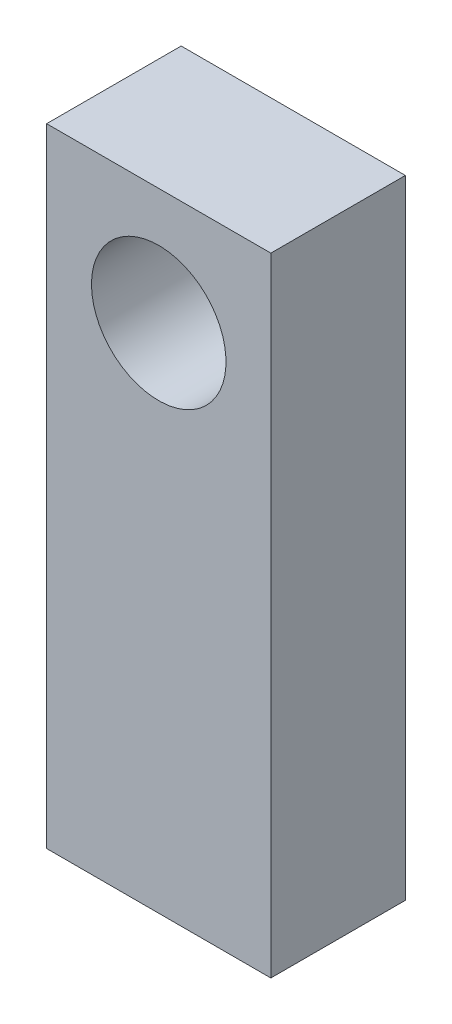
ISO-10303-21;
HEADER;
FILE_DESCRIPTION(('STEP AP214'),'2;1');
FILE_NAME('part.step','',(''),(''),'','','');
FILE_SCHEMA(('AUTOMOTIVE_DESIGN { 1 0 10303 214 1 1 1 1 }'));
ENDSEC;
DATA;
#1=APPLICATION_CONTEXT('core data for automotive mechanical design processes');
#2=APPLICATION_PROTOCOL_DEFINITION('international standard','automotive_design',2000,#1);
#3=PRODUCT_CONTEXT('',#1,'mechanical');
#4=PRODUCT('Part','Part','',(#3));
#5=PRODUCT_RELATED_PRODUCT_CATEGORY('part','',(#4));
#6=PRODUCT_DEFINITION_FORMATION('','',#4);
#7=PRODUCT_DEFINITION_CONTEXT('part definition',#1,'design');
#8=PRODUCT_DEFINITION('design','',#6,#7);
#9=PRODUCT_DEFINITION_SHAPE('','',#8);
#10=(LENGTH_UNIT() NAMED_UNIT(*) SI_UNIT(.MILLI.,.METRE.));
#11=(NAMED_UNIT(*) PLANE_ANGLE_UNIT() SI_UNIT($,.RADIAN.));
#12=(NAMED_UNIT(*) SI_UNIT($,.STERADIAN.) SOLID_ANGLE_UNIT());
#13=UNCERTAINTY_MEASURE_WITH_UNIT(LENGTH_MEASURE(1.E-05),#10,'distance_accuracy_value','');
#14=(GEOMETRIC_REPRESENTATION_CONTEXT(3) GLOBAL_UNCERTAINTY_ASSIGNED_CONTEXT((#13)) GLOBAL_UNIT_ASSIGNED_CONTEXT((#10,
#11,#12)) REPRESENTATION_CONTEXT('',''));
#15=CARTESIAN_POINT('',(0.,0.,0.));
#16=DIRECTION('',(0.,0.,1.));
#17=DIRECTION('',(1.,0.,0.));
#18=AXIS2_PLACEMENT_3D('',#15,#16,#17);
#19=CARTESIAN_POINT('',(0.,0.,7.62));
#20=DIRECTION('',(0.,0.,1.));
#21=DIRECTION('',(1.,0.,0.));
#22=AXIS2_PLACEMENT_3D('',#19,#20,#21);
#23=PLANE('',#22);
#24=DIRECTION('',(0.,1.,0.));
#25=VECTOR('',#24,1.);
#26=CARTESIAN_POINT('',(6.35,6.604,7.62));
#27=LINE('',#26,#25);
#28=CARTESIAN_POINT('',(6.35,-28.956,7.62));
#29=VERTEX_POINT('',#28);
#30=CARTESIAN_POINT('',(6.35,6.604,7.62));
#31=VERTEX_POINT('',#30);
#32=EDGE_CURVE('E98',#29,#31,#27,.T.);
#33=ORIENTED_EDGE('',*,*,#32,.T.);
#34=DIRECTION('',(-1.,0.,0.));
#35=VECTOR('',#34,1.);
#36=CARTESIAN_POINT('',(-6.35,6.604,7.62));
#37=LINE('',#36,#35);
#38=CARTESIAN_POINT('',(-6.35,6.604,7.62));
#39=VERTEX_POINT('',#38);
#40=EDGE_CURVE('E93',#31,#39,#37,.T.);
#41=ORIENTED_EDGE('',*,*,#40,.T.);
#42=DIRECTION('',(0.,-1.,0.));
#43=VECTOR('',#42,1.);
#44=CARTESIAN_POINT('',(-6.35,-28.956,7.62));
#45=LINE('',#44,#43);
#46=CARTESIAN_POINT('',(-6.35,-28.956,7.62));
#47=VERTEX_POINT('',#46);
#48=EDGE_CURVE('E96',#39,#47,#45,.T.);
#49=ORIENTED_EDGE('',*,*,#48,.T.);
#50=DIRECTION('',(1.,0.,0.));
#51=VECTOR('',#50,1.);
#52=CARTESIAN_POINT('',(-6.35,-28.956,7.62));
#53=LINE('',#52,#51);
#54=EDGE_CURVE('E63',#47,#29,#53,.T.);
#55=ORIENTED_EDGE('',*,*,#54,.T.);
#56=EDGE_LOOP('',(#33,#41,#49,#55));
#57=FACE_BOUND('',#56,.T.);
#58=CARTESIAN_POINT('',(0.,0.,7.62));
#59=DIRECTION('',(0.,0.,1.));
#60=DIRECTION('',(1.,0.,0.));
#61=AXIS2_PLACEMENT_3D('',#58,#59,#60);
#62=CIRCLE('',#61,3.81);
#63=CARTESIAN_POINT('',(-3.81,0.,7.62));
#64=VERTEX_POINT('',#63);
#65=EDGE_CURVE('E118',#64,#64,#62,.T.);
#66=ORIENTED_EDGE('',*,*,#65,.F.);
#67=EDGE_LOOP('',(#66));
#68=FACE_BOUND('',#67,.T.);
#69=ADVANCED_FACE('F45',(#57,#68),#23,.T.);
#70=CARTESIAN_POINT('',(0.,0.,0.));
#71=DIRECTION('',(0.,0.,1.));
#72=DIRECTION('',(1.,0.,0.));
#73=AXIS2_PLACEMENT_3D('',#70,#71,#72);
#74=PLANE('',#73);
#75=DIRECTION('',(0.,1.,0.));
#76=VECTOR('',#75,1.);
#77=CARTESIAN_POINT('',(6.35,6.604,0.));
#78=LINE('',#77,#76);
#79=CARTESIAN_POINT('',(6.35,-28.956,0.));
#80=VERTEX_POINT('',#79);
#81=CARTESIAN_POINT('',(6.35,6.604,0.));
#82=VERTEX_POINT('',#81);
#83=EDGE_CURVE('E114',#80,#82,#78,.T.);
#84=ORIENTED_EDGE('',*,*,#83,.F.);
#85=DIRECTION('',(1.,0.,0.));
#86=VECTOR('',#85,1.);
#87=CARTESIAN_POINT('',(-6.35,-28.956,0.));
#88=LINE('',#87,#86);
#89=CARTESIAN_POINT('',(-6.35,-28.956,0.));
#90=VERTEX_POINT('',#89);
#91=EDGE_CURVE('E86',#90,#80,#88,.T.);
#92=ORIENTED_EDGE('',*,*,#91,.F.);
#93=DIRECTION('',(0.,-1.,0.));
#94=VECTOR('',#93,1.);
#95=CARTESIAN_POINT('',(-6.35,-28.956,0.));
#96=LINE('',#95,#94);
#97=CARTESIAN_POINT('',(-6.35,6.604,0.));
#98=VERTEX_POINT('',#97);
#99=EDGE_CURVE('E80',#98,#90,#96,.T.);
#100=ORIENTED_EDGE('',*,*,#99,.F.);
#101=DIRECTION('',(-1.,0.,0.));
#102=VECTOR('',#101,1.);
#103=CARTESIAN_POINT('',(-6.35,6.604,0.));
#104=LINE('',#103,#102);
#105=EDGE_CURVE('E103',#82,#98,#104,.T.);
#106=ORIENTED_EDGE('',*,*,#105,.F.);
#107=EDGE_LOOP('',(#84,#92,#100,#106));
#108=FACE_BOUND('',#107,.T.);
#109=CARTESIAN_POINT('',(0.,0.,0.));
#110=DIRECTION('',(0.,0.,1.));
#111=DIRECTION('',(1.,0.,0.));
#112=AXIS2_PLACEMENT_3D('',#109,#110,#111);
#113=CIRCLE('',#112,3.81);
#114=CARTESIAN_POINT('',(-3.81,0.,0.));
#115=VERTEX_POINT('',#114);
#116=EDGE_CURVE('E136',#115,#115,#113,.T.);
#117=ORIENTED_EDGE('',*,*,#116,.T.);
#118=EDGE_LOOP('',(#117));
#119=FACE_BOUND('',#118,.T.);
#120=ADVANCED_FACE('F131',(#108,#119),#74,.F.);
#121=CARTESIAN_POINT('',(6.35,6.604,7.62));
#122=DIRECTION('',(-1.,0.,0.));
#123=DIRECTION('',(0.,-1.,0.));
#124=AXIS2_PLACEMENT_3D('',#121,#122,#123);
#125=PLANE('',#124);
#126=ORIENTED_EDGE('',*,*,#83,.T.);
#127=DIRECTION('',(0.,0.,-1.));
#128=VECTOR('',#127,1.);
#129=CARTESIAN_POINT('',(6.35,6.604,7.62));
#130=LINE('',#129,#128);
#131=EDGE_CURVE('E11',#31,#82,#130,.T.);
#132=ORIENTED_EDGE('',*,*,#131,.F.);
#133=ORIENTED_EDGE('',*,*,#32,.F.);
#134=DIRECTION('',(0.,0.,-1.));
#135=VECTOR('',#134,1.);
#136=CARTESIAN_POINT('',(6.35,-28.956,7.62));
#137=LINE('',#136,#135);
#138=EDGE_CURVE('E110',#29,#80,#137,.T.);
#139=ORIENTED_EDGE('',*,*,#138,.T.);
#140=EDGE_LOOP('',(#126,#132,#133,#139));
#141=FACE_BOUND('',#140,.T.);
#142=ADVANCED_FACE('F47',(#141),#125,.F.);
#143=CARTESIAN_POINT('',(-6.35,6.604,7.62));
#144=DIRECTION('',(0.,-1.,0.));
#145=DIRECTION('',(0.,0.,-1.));
#146=AXIS2_PLACEMENT_3D('',#143,#144,#145);
#147=PLANE('',#146);
#148=ORIENTED_EDGE('',*,*,#105,.T.);
#149=DIRECTION('',(0.,0.,-1.));
#150=VECTOR('',#149,1.);
#151=CARTESIAN_POINT('',(-6.35,6.604,7.62));
#152=LINE('',#151,#150);
#153=EDGE_CURVE('E55',#39,#98,#152,.T.);
#154=ORIENTED_EDGE('',*,*,#153,.F.);
#155=ORIENTED_EDGE('',*,*,#40,.F.);
#156=ORIENTED_EDGE('',*,*,#131,.T.);
#157=EDGE_LOOP('',(#148,#154,#155,#156));
#158=FACE_BOUND('',#157,.T.);
#159=ADVANCED_FACE('F102',(#158),#147,.F.);
#160=CARTESIAN_POINT('',(-6.35,-28.956,7.62));
#161=DIRECTION('',(1.,0.,0.));
#162=DIRECTION('',(0.,0.,-1.));
#163=AXIS2_PLACEMENT_3D('',#160,#161,#162);
#164=PLANE('',#163);
#165=ORIENTED_EDGE('',*,*,#99,.T.);
#166=DIRECTION('',(0.,0.,-1.));
#167=VECTOR('',#166,1.);
#168=CARTESIAN_POINT('',(-6.35,-28.956,7.62));
#169=LINE('',#168,#167);
#170=EDGE_CURVE('E105',#47,#90,#169,.T.);
#171=ORIENTED_EDGE('',*,*,#170,.F.);
#172=ORIENTED_EDGE('',*,*,#48,.F.);
#173=ORIENTED_EDGE('',*,*,#153,.T.);
#174=EDGE_LOOP('',(#165,#171,#172,#173));
#175=FACE_BOUND('',#174,.T.);
#176=ADVANCED_FACE('F106',(#175),#164,.F.);
#177=CARTESIAN_POINT('',(-6.35,-28.956,7.62));
#178=DIRECTION('',(0.,1.,0.));
#179=DIRECTION('',(-1.,0.,0.));
#180=AXIS2_PLACEMENT_3D('',#177,#178,#179);
#181=PLANE('',#180);
#182=ORIENTED_EDGE('',*,*,#91,.T.);
#183=ORIENTED_EDGE('',*,*,#138,.F.);
#184=ORIENTED_EDGE('',*,*,#54,.F.);
#185=ORIENTED_EDGE('',*,*,#170,.T.);
#186=EDGE_LOOP('',(#182,#183,#184,#185));
#187=FACE_BOUND('',#186,.T.);
#188=ADVANCED_FACE('F128',(#187),#181,.F.);
#189=CARTESIAN_POINT('',(0.,0.,7.62));
#190=DIRECTION('',(0.,0.,-1.));
#191=DIRECTION('',(-1.,0.,0.));
#192=AXIS2_PLACEMENT_3D('',#189,#190,#191);
#193=CYLINDRICAL_SURFACE('',#192,3.81);
#194=CARTESIAN_POINT('',(-3.81,0.,7.62));
#195=CARTESIAN_POINT('',(-3.81,0.,7.540625));
#196=CARTESIAN_POINT('',(-3.81,0.,7.46125));
#197=CARTESIAN_POINT('',(-3.81,0.,7.3025));
#198=CARTESIAN_POINT('',(-3.81,0.,7.223125));
#199=CARTESIAN_POINT('',(-3.81,0.,7.064375));
#200=CARTESIAN_POINT('',(-3.81,0.,6.985));
#201=CARTESIAN_POINT('',(-3.81,0.,6.82625));
#202=CARTESIAN_POINT('',(-3.81,0.,6.746875));
#203=CARTESIAN_POINT('',(-3.81,0.,6.588125));
#204=CARTESIAN_POINT('',(-3.81,0.,6.50875));
#205=CARTESIAN_POINT('',(-3.81,0.,6.35));
#206=CARTESIAN_POINT('',(-3.81,0.,6.270625));
#207=CARTESIAN_POINT('',(-3.81,0.,6.111875));
#208=CARTESIAN_POINT('',(-3.81,0.,6.0325));
#209=CARTESIAN_POINT('',(-3.81,0.,5.87375));
#210=CARTESIAN_POINT('',(-3.81,0.,5.794375));
#211=CARTESIAN_POINT('',(-3.81,0.,5.635625));
#212=CARTESIAN_POINT('',(-3.81,0.,5.55625));
#213=CARTESIAN_POINT('',(-3.81,0.,5.3975));
#214=CARTESIAN_POINT('',(-3.81,0.,5.318125));
#215=CARTESIAN_POINT('',(-3.81,0.,5.159375));
#216=CARTESIAN_POINT('',(-3.81,0.,5.08));
#217=CARTESIAN_POINT('',(-3.81,0.,4.92125));
#218=CARTESIAN_POINT('',(-3.81,0.,4.841875));
#219=CARTESIAN_POINT('',(-3.81,0.,4.683125));
#220=CARTESIAN_POINT('',(-3.81,0.,4.60375));
#221=CARTESIAN_POINT('',(-3.81,0.,4.445));
#222=CARTESIAN_POINT('',(-3.81,0.,4.365625));
#223=CARTESIAN_POINT('',(-3.81,0.,4.206875));
#224=CARTESIAN_POINT('',(-3.81,0.,4.1275));
#225=CARTESIAN_POINT('',(-3.81,0.,3.96875));
#226=CARTESIAN_POINT('',(-3.81,0.,3.889375));
#227=CARTESIAN_POINT('',(-3.81,0.,3.730625));
#228=CARTESIAN_POINT('',(-3.81,0.,3.65125));
#229=CARTESIAN_POINT('',(-3.81,0.,3.4925));
#230=CARTESIAN_POINT('',(-3.81,0.,3.413125));
#231=CARTESIAN_POINT('',(-3.81,0.,3.254375));
#232=CARTESIAN_POINT('',(-3.81,0.,3.175));
#233=CARTESIAN_POINT('',(-3.81,0.,3.01625));
#234=CARTESIAN_POINT('',(-3.81,0.,2.936875));
#235=CARTESIAN_POINT('',(-3.81,0.,2.778125));
#236=CARTESIAN_POINT('',(-3.81,0.,2.69875));
#237=CARTESIAN_POINT('',(-3.81,0.,2.54));
#238=CARTESIAN_POINT('',(-3.81,0.,2.460625));
#239=CARTESIAN_POINT('',(-3.81,0.,2.301875));
#240=CARTESIAN_POINT('',(-3.81,0.,2.2225));
#241=CARTESIAN_POINT('',(-3.81,0.,2.06375));
#242=CARTESIAN_POINT('',(-3.81,0.,1.984375));
#243=CARTESIAN_POINT('',(-3.81,0.,1.825625));
#244=CARTESIAN_POINT('',(-3.81,0.,1.74625));
#245=CARTESIAN_POINT('',(-3.81,0.,1.5875));
#246=CARTESIAN_POINT('',(-3.81,0.,1.508125));
#247=CARTESIAN_POINT('',(-3.81,0.,1.349375));
#248=CARTESIAN_POINT('',(-3.81,0.,1.27));
#249=CARTESIAN_POINT('',(-3.81,0.,1.11125));
#250=CARTESIAN_POINT('',(-3.81,0.,1.031875));
#251=CARTESIAN_POINT('',(-3.81,0.,0.873125));
#252=CARTESIAN_POINT('',(-3.81,0.,0.79375));
#253=CARTESIAN_POINT('',(-3.81,0.,0.635));
#254=CARTESIAN_POINT('',(-3.81,0.,0.555625));
#255=CARTESIAN_POINT('',(-3.81,0.,0.396875));
#256=CARTESIAN_POINT('',(-3.81,0.,0.3175));
#257=CARTESIAN_POINT('',(-3.81,0.,0.15875));
#258=CARTESIAN_POINT('',(-3.81,0.,0.0793749999999999));
#259=CARTESIAN_POINT('',(-3.81,0.,0.));
#260=B_SPLINE_CURVE_WITH_KNOTS('',3,(#194,#195,#196,#197,#198,#199,#200,#201,#202,#203,#204,
#205,#206,#207,#208,#209,#210,#211,#212,#213,#214,#215,#216,#217,#218,#219,#220,#221,#222,#223,
#224,#225,#226,#227,#228,#229,#230,#231,#232,#233,#234,#235,#236,#237,#238,#239,#240,#241,#242,
#243,#244,#245,#246,#247,#248,#249,#250,#251,#252,#253,#254,#255,#256,#257,#258,#259),
.UNSPECIFIED.,.F.,.F.,(4,2,2,2,2,2,2,2,2,2,2,2,2,2,2,2,2,2,2,2,2,2,2,2,2,2,2,2,2,2,2,2,4),(0.,
0.238125,0.47625,0.714375000000001,0.9525,1.190625,1.42875,1.666875,1.905,2.143125,2.38125,
2.619375,2.8575,3.095625,3.33375,3.571875,3.81,4.048125,4.28625,4.524375,4.7625,5.000625,
5.23875,5.476875,5.715,5.953125,6.19125,6.429375,6.6675,6.905625,7.14375,7.381875,7.62),.UNSPECIFIED.);
#261=EDGE_CURVE('BSEAM144',#64,#115,#260,.T.);
#262=ORIENTED_EDGE('',*,*,#65,.T.);
#263=ORIENTED_EDGE('',*,*,#116,.F.);
#264=ORIENTED_EDGE('',*,*,#261,.T.);
#265=ORIENTED_EDGE('',*,*,#261,.F.);
#266=EDGE_LOOP('',(#262,#264,#263,#265));
#267=FACE_BOUND('',#266,.T.);
#268=ADVANCED_FACE('F144',(#267),#193,.F.);
#269=CLOSED_SHELL('',(#69,#120,#142,#159,#176,#188,#268));
#270=MANIFOLD_SOLID_BREP('B2',#269);
#271=ADVANCED_BREP_SHAPE_REPRESENTATION('',(#18,#270),#14);
#272=SHAPE_DEFINITION_REPRESENTATION(#9,#271);
ENDSEC;
END-ISO-10303-21;
